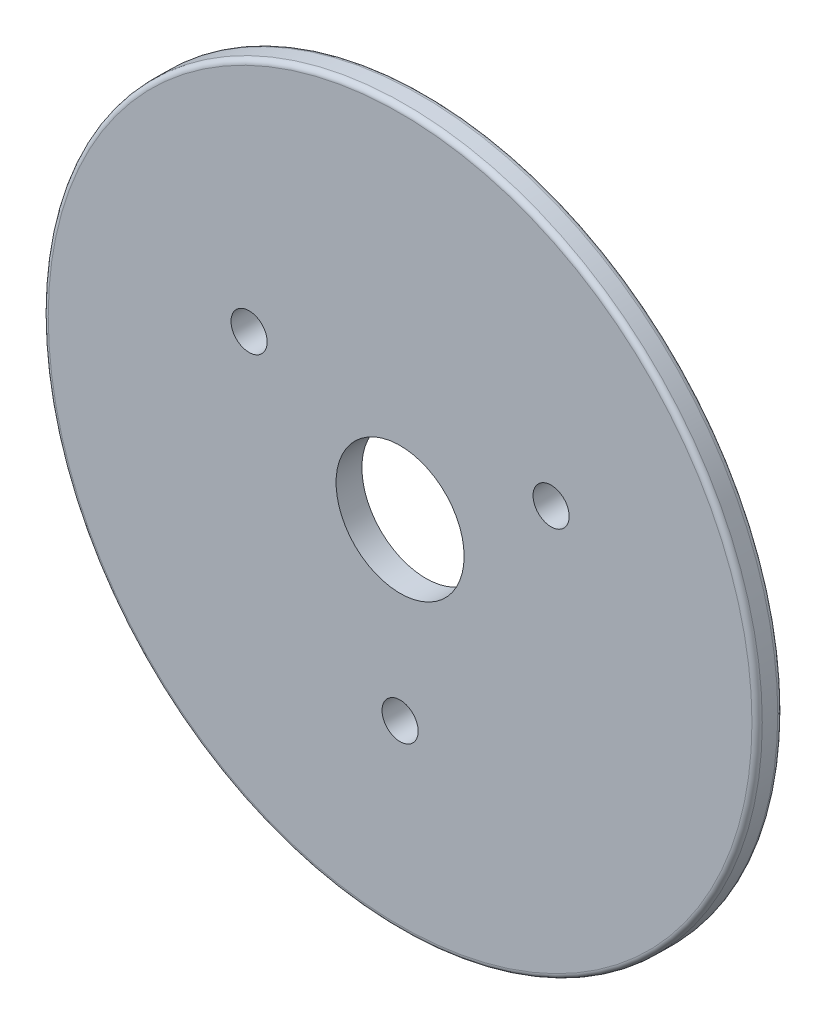
ISO-10303-21;
HEADER;
FILE_DESCRIPTION(('STEP AP214'),'2;1');
FILE_NAME('part.step','',(''),(''),'','','');
FILE_SCHEMA(('AUTOMOTIVE_DESIGN { 1 0 10303 214 1 1 1 1 }'));
ENDSEC;
DATA;
#1=APPLICATION_CONTEXT('core data for automotive mechanical design processes');
#2=APPLICATION_PROTOCOL_DEFINITION('international standard','automotive_design',2000,#1);
#3=PRODUCT_CONTEXT('',#1,'mechanical');
#4=PRODUCT('Part','Part','',(#3));
#5=PRODUCT_RELATED_PRODUCT_CATEGORY('part','',(#4));
#6=PRODUCT_DEFINITION_FORMATION('','',#4);
#7=PRODUCT_DEFINITION_CONTEXT('part definition',#1,'design');
#8=PRODUCT_DEFINITION('design','',#6,#7);
#9=PRODUCT_DEFINITION_SHAPE('','',#8);
#10=(LENGTH_UNIT() NAMED_UNIT(*) SI_UNIT(.MILLI.,.METRE.));
#11=(NAMED_UNIT(*) PLANE_ANGLE_UNIT() SI_UNIT($,.RADIAN.));
#12=(NAMED_UNIT(*) SI_UNIT($,.STERADIAN.) SOLID_ANGLE_UNIT());
#13=UNCERTAINTY_MEASURE_WITH_UNIT(LENGTH_MEASURE(1.E-05),#10,'distance_accuracy_value','');
#14=(GEOMETRIC_REPRESENTATION_CONTEXT(3) GLOBAL_UNCERTAINTY_ASSIGNED_CONTEXT((#13)) GLOBAL_UNIT_ASSIGNED_CONTEXT((#10,
#11,#12)) REPRESENTATION_CONTEXT('',''));
#15=CARTESIAN_POINT('',(0.,0.,0.));
#16=DIRECTION('',(0.,0.,1.));
#17=DIRECTION('',(1.,0.,0.));
#18=AXIS2_PLACEMENT_3D('',#15,#16,#17);
#19=CARTESIAN_POINT('',(14.6246254027445,8.44353141307197,-17.25));
#20=DIRECTION('',(0.,0.,1.));
#21=DIRECTION('',(1.,0.,0.));
#22=AXIS2_PLACEMENT_3D('',#19,#20,#21);
#23=CYLINDRICAL_SURFACE('',#22,1.75);
#24=CARTESIAN_POINT('',(14.6246254027445,8.44353141307197,-17.25));
#25=DIRECTION('',(0.,0.,1.));
#26=DIRECTION('',(1.,0.,0.));
#27=AXIS2_PLACEMENT_3D('',#24,#25,#26);
#28=CIRCLE('',#27,1.75);
#29=CARTESIAN_POINT('',(16.3746254027445,8.44353141307197,-17.25));
#30=VERTEX_POINT('',#29);
#31=EDGE_CURVE('E58',#30,#30,#28,.T.);
#32=ORIENTED_EDGE('',*,*,#31,.F.);
#33=EDGE_LOOP('',(#32));
#34=FACE_BOUND('',#33,.T.);
#35=CARTESIAN_POINT('',(14.6246254027445,8.44353141307197,-14.75));
#36=DIRECTION('',(0.,0.,1.));
#37=DIRECTION('',(1.,0.,0.));
#38=AXIS2_PLACEMENT_3D('',#35,#36,#37);
#39=CIRCLE('',#38,1.75);
#40=CARTESIAN_POINT('',(16.3746254027445,8.44353141307197,-14.75));
#41=VERTEX_POINT('',#40);
#42=EDGE_CURVE('E62',#41,#41,#39,.F.);
#43=ORIENTED_EDGE('',*,*,#42,.F.);
#44=EDGE_LOOP('',(#43));
#45=FACE_BOUND('',#44,.T.);
#46=ADVANCED_FACE('F34',(#34,#45),#23,.F.);
#47=CARTESIAN_POINT('',(-14.6246254027445,8.44353141307194,-17.25));
#48=DIRECTION('',(0.,0.,1.));
#49=DIRECTION('',(1.,0.,0.));
#50=AXIS2_PLACEMENT_3D('',#47,#48,#49);
#51=CYLINDRICAL_SURFACE('',#50,1.75);
#52=CARTESIAN_POINT('',(-14.6246254027445,8.44353141307194,-17.25));
#53=DIRECTION('',(0.,0.,1.));
#54=DIRECTION('',(1.,0.,0.));
#55=AXIS2_PLACEMENT_3D('',#52,#53,#54);
#56=CIRCLE('',#55,1.75);
#57=CARTESIAN_POINT('',(-12.8746254027445,8.44353141307194,-17.25));
#58=VERTEX_POINT('',#57);
#59=EDGE_CURVE('E61',#58,#58,#56,.T.);
#60=ORIENTED_EDGE('',*,*,#59,.F.);
#61=EDGE_LOOP('',(#60));
#62=FACE_BOUND('',#61,.T.);
#63=CARTESIAN_POINT('',(-14.6246254027445,8.44353141307194,-14.75));
#64=DIRECTION('',(0.,0.,1.));
#65=DIRECTION('',(1.,0.,0.));
#66=AXIS2_PLACEMENT_3D('',#63,#64,#65);
#67=CIRCLE('',#66,1.75);
#68=CARTESIAN_POINT('',(-12.8746254027445,8.44353141307194,-14.75));
#69=VERTEX_POINT('',#68);
#70=EDGE_CURVE('E69',#69,#69,#67,.F.);
#71=ORIENTED_EDGE('',*,*,#70,.F.);
#72=EDGE_LOOP('',(#71));
#73=FACE_BOUND('',#72,.T.);
#74=ADVANCED_FACE('F95',(#62,#73),#51,.F.);
#75=CARTESIAN_POINT('',(0.,-16.8870628261439,-17.25));
#76=DIRECTION('',(0.,0.,1.));
#77=DIRECTION('',(1.,0.,0.));
#78=AXIS2_PLACEMENT_3D('',#75,#76,#77);
#79=CYLINDRICAL_SURFACE('',#78,1.75);
#80=CARTESIAN_POINT('',(0.,-16.8870628261439,-17.25));
#81=DIRECTION('',(0.,0.,1.));
#82=DIRECTION('',(1.,0.,0.));
#83=AXIS2_PLACEMENT_3D('',#80,#81,#82);
#84=CIRCLE('',#83,1.75);
#85=CARTESIAN_POINT('',(1.75,-16.8870628261439,-17.25));
#86=VERTEX_POINT('',#85);
#87=EDGE_CURVE('E57',#86,#86,#84,.T.);
#88=ORIENTED_EDGE('',*,*,#87,.F.);
#89=EDGE_LOOP('',(#88));
#90=FACE_BOUND('',#89,.T.);
#91=CARTESIAN_POINT('',(0.,-16.8870628261439,-14.75));
#92=DIRECTION('',(0.,0.,1.));
#93=DIRECTION('',(1.,0.,0.));
#94=AXIS2_PLACEMENT_3D('',#91,#92,#93);
#95=CIRCLE('',#94,1.75);
#96=CARTESIAN_POINT('',(1.75,-16.8870628261439,-14.75));
#97=VERTEX_POINT('',#96);
#98=EDGE_CURVE('E72',#97,#97,#95,.F.);
#99=ORIENTED_EDGE('',*,*,#98,.F.);
#100=EDGE_LOOP('',(#99));
#101=FACE_BOUND('',#100,.T.);
#102=ADVANCED_FACE('F85',(#90,#101),#79,.F.);
#103=CARTESIAN_POINT('',(0.,0.,-7.25));
#104=DIRECTION('',(0.,0.,1.));
#105=DIRECTION('',(1.,0.,0.));
#106=AXIS2_PLACEMENT_3D('',#103,#104,#105);
#107=CYLINDRICAL_SURFACE('',#106,6.2);
#108=CARTESIAN_POINT('',(0.,0.,-17.25));
#109=DIRECTION('',(0.,0.,1.));
#110=DIRECTION('',(1.,0.,0.));
#111=AXIS2_PLACEMENT_3D('',#108,#109,#110);
#112=CIRCLE('',#111,6.2);
#113=CARTESIAN_POINT('',(6.2,0.,-17.25));
#114=VERTEX_POINT('',#113);
#115=EDGE_CURVE('E54',#114,#114,#112,.F.);
#116=CARTESIAN_POINT('',(0.,0.,-14.75));
#117=DIRECTION('',(0.,0.,1.));
#118=DIRECTION('',(1.,0.,0.));
#119=AXIS2_PLACEMENT_3D('',#116,#117,#118);
#120=CIRCLE('',#119,6.2);
#121=CARTESIAN_POINT('',(6.2,0.,-14.75));
#122=VERTEX_POINT('',#121);
#123=EDGE_CURVE('E75',#122,#122,#120,.F.);
#124=CARTESIAN_POINT('',(6.2,0.,-17.25));
#125=CARTESIAN_POINT('',(6.2,0.,-17.2239583333333));
#126=CARTESIAN_POINT('',(6.2,0.,-17.1979166666667));
#127=CARTESIAN_POINT('',(6.2,0.,-17.1458333333333));
#128=CARTESIAN_POINT('',(6.2,0.,-17.1197916666667));
#129=CARTESIAN_POINT('',(6.2,0.,-17.0677083333333));
#130=CARTESIAN_POINT('',(6.2,0.,-17.0416666666667));
#131=CARTESIAN_POINT('',(6.2,0.,-16.9895833333333));
#132=CARTESIAN_POINT('',(6.2,0.,-16.9635416666667));
#133=CARTESIAN_POINT('',(6.2,0.,-16.9114583333333));
#134=CARTESIAN_POINT('',(6.2,0.,-16.8854166666667));
#135=CARTESIAN_POINT('',(6.2,0.,-16.8333333333333));
#136=CARTESIAN_POINT('',(6.2,0.,-16.8072916666667));
#137=CARTESIAN_POINT('',(6.2,0.,-16.7552083333333));
#138=CARTESIAN_POINT('',(6.2,0.,-16.7291666666667));
#139=CARTESIAN_POINT('',(6.2,0.,-16.6770833333333));
#140=CARTESIAN_POINT('',(6.2,0.,-16.6510416666667));
#141=CARTESIAN_POINT('',(6.2,0.,-16.5989583333333));
#142=CARTESIAN_POINT('',(6.2,0.,-16.5729166666667));
#143=CARTESIAN_POINT('',(6.2,0.,-16.5208333333333));
#144=CARTESIAN_POINT('',(6.2,0.,-16.4947916666667));
#145=CARTESIAN_POINT('',(6.2,0.,-16.4427083333333));
#146=CARTESIAN_POINT('',(6.2,0.,-16.4166666666667));
#147=CARTESIAN_POINT('',(6.2,0.,-16.3645833333333));
#148=CARTESIAN_POINT('',(6.2,0.,-16.3385416666667));
#149=CARTESIAN_POINT('',(6.2,0.,-16.2864583333333));
#150=CARTESIAN_POINT('',(6.2,0.,-16.2604166666667));
#151=CARTESIAN_POINT('',(6.2,0.,-16.2083333333333));
#152=CARTESIAN_POINT('',(6.2,0.,-16.1822916666667));
#153=CARTESIAN_POINT('',(6.2,0.,-16.1302083333333));
#154=CARTESIAN_POINT('',(6.2,0.,-16.1041666666667));
#155=CARTESIAN_POINT('',(6.2,0.,-16.0520833333333));
#156=CARTESIAN_POINT('',(6.2,0.,-16.0260416666667));
#157=CARTESIAN_POINT('',(6.2,0.,-15.9739583333333));
#158=CARTESIAN_POINT('',(6.2,0.,-15.9479166666667));
#159=CARTESIAN_POINT('',(6.2,0.,-15.8958333333333));
#160=CARTESIAN_POINT('',(6.2,0.,-15.8697916666667));
#161=CARTESIAN_POINT('',(6.2,0.,-15.8177083333333));
#162=CARTESIAN_POINT('',(6.2,0.,-15.7916666666667));
#163=CARTESIAN_POINT('',(6.2,0.,-15.7395833333333));
#164=CARTESIAN_POINT('',(6.2,0.,-15.7135416666667));
#165=CARTESIAN_POINT('',(6.2,0.,-15.6614583333333));
#166=CARTESIAN_POINT('',(6.2,0.,-15.6354166666667));
#167=CARTESIAN_POINT('',(6.2,0.,-15.5833333333333));
#168=CARTESIAN_POINT('',(6.2,0.,-15.5572916666667));
#169=CARTESIAN_POINT('',(6.2,0.,-15.5052083333333));
#170=CARTESIAN_POINT('',(6.2,0.,-15.4791666666667));
#171=CARTESIAN_POINT('',(6.2,0.,-15.4270833333333));
#172=CARTESIAN_POINT('',(6.2,0.,-15.4010416666667));
#173=CARTESIAN_POINT('',(6.2,0.,-15.3489583333333));
#174=CARTESIAN_POINT('',(6.2,0.,-15.3229166666667));
#175=CARTESIAN_POINT('',(6.2,0.,-15.2708333333333));
#176=CARTESIAN_POINT('',(6.2,0.,-15.2447916666667));
#177=CARTESIAN_POINT('',(6.2,0.,-15.1927083333333));
#178=CARTESIAN_POINT('',(6.2,0.,-15.1666666666667));
#179=CARTESIAN_POINT('',(6.2,0.,-15.1145833333333));
#180=CARTESIAN_POINT('',(6.2,0.,-15.0885416666667));
#181=CARTESIAN_POINT('',(6.2,0.,-15.0364583333333));
#182=CARTESIAN_POINT('',(6.2,0.,-15.0104166666667));
#183=CARTESIAN_POINT('',(6.2,0.,-14.9583333333333));
#184=CARTESIAN_POINT('',(6.2,0.,-14.9322916666667));
#185=CARTESIAN_POINT('',(6.2,0.,-14.8802083333333));
#186=CARTESIAN_POINT('',(6.2,0.,-14.8541666666667));
#187=CARTESIAN_POINT('',(6.2,0.,-14.8020833333333));
#188=CARTESIAN_POINT('',(6.2,0.,-14.7760416666667));
#189=CARTESIAN_POINT('',(6.2,0.,-14.75));
#190=B_SPLINE_CURVE_WITH_KNOTS('',3,(#124,#125,#126,#127,#128,#129,#130,#131,#132,#133,#134,
#135,#136,#137,#138,#139,#140,#141,#142,#143,#144,#145,#146,#147,#148,#149,#150,#151,#152,#153,
#154,#155,#156,#157,#158,#159,#160,#161,#162,#163,#164,#165,#166,#167,#168,#169,#170,#171,#172,
#173,#174,#175,#176,#177,#178,#179,#180,#181,#182,#183,#184,#185,#186,#187,#188,#189),
.UNSPECIFIED.,.F.,.F.,(4,2,2,2,2,2,2,2,2,2,2,2,2,2,2,2,2,2,2,2,2,2,2,2,2,2,2,2,2,2,2,2,4),(0.,
0.0781250000000018,0.15625,0.234375000000002,0.3125,0.390625000000002,0.46875,0.546875000000002,
0.625000000000001,0.703125000000002,0.781250000000001,0.859375000000002,0.937500000000001,
1.015625,1.09375,1.171875,1.25,1.328125,1.40625,1.484375,1.5625,1.640625,1.71875,1.796875,1.875,
1.953125,2.03125,2.109375,2.1875,2.265625,2.34375,2.421875,2.5),.UNSPECIFIED.);
#191=EDGE_CURVE('BSEAM82',#114,#122,#190,.T.);
#192=ORIENTED_EDGE('',*,*,#115,.T.);
#193=ORIENTED_EDGE('',*,*,#123,.F.);
#194=ORIENTED_EDGE('',*,*,#191,.T.);
#195=ORIENTED_EDGE('',*,*,#191,.F.);
#196=EDGE_LOOP('',(#192,#194,#193,#195));
#197=FACE_BOUND('',#196,.T.);
#198=ADVANCED_FACE('F82',(#197),#107,.F.);
#199=CARTESIAN_POINT('',(0.,0.,-17.25));
#200=DIRECTION('',(0.,0.,1.));
#201=DIRECTION('',(1.,0.,0.));
#202=AXIS2_PLACEMENT_3D('',#199,#200,#201);
#203=CYLINDRICAL_SURFACE('',#202,34.5756536779815);
#204=CARTESIAN_POINT('',(0.,0.,-15.25));
#205=DIRECTION('',(0.,0.,-1.));
#206=DIRECTION('',(-1.,0.,0.));
#207=AXIS2_PLACEMENT_3D('',#204,#205,#206);
#208=CIRCLE('',#207,34.5756536779815);
#209=CARTESIAN_POINT('',(-34.5756536779815,0.,-15.25));
#210=VERTEX_POINT('',#209);
#211=EDGE_CURVE('E45',#210,#210,#208,.T.);
#212=ORIENTED_EDGE('',*,*,#211,.T.);
#213=EDGE_LOOP('',(#212));
#214=FACE_BOUND('',#213,.T.);
#215=CARTESIAN_POINT('',(0.,0.,-16.75));
#216=DIRECTION('',(0.,0.,-1.));
#217=DIRECTION('',(-1.,0.,0.));
#218=AXIS2_PLACEMENT_3D('',#215,#216,#217);
#219=CIRCLE('',#218,34.5756536779815);
#220=CARTESIAN_POINT('',(-34.5756536779815,0.,-16.75));
#221=VERTEX_POINT('',#220);
#222=EDGE_CURVE('E49',#221,#221,#219,.F.);
#223=ORIENTED_EDGE('',*,*,#222,.T.);
#224=EDGE_LOOP('',(#223));
#225=FACE_BOUND('',#224,.T.);
#226=ADVANCED_FACE('F84',(#214,#225),#203,.T.);
#227=CARTESIAN_POINT('',(0.,0.,-17.25));
#228=DIRECTION('',(0.,0.,-1.));
#229=DIRECTION('',(-1.,0.,0.));
#230=AXIS2_PLACEMENT_3D('',#227,#228,#229);
#231=PLANE('',#230);
#232=ORIENTED_EDGE('',*,*,#87,.T.);
#233=EDGE_LOOP('',(#232));
#234=FACE_BOUND('',#233,.T.);
#235=ORIENTED_EDGE('',*,*,#59,.T.);
#236=EDGE_LOOP('',(#235));
#237=FACE_BOUND('',#236,.T.);
#238=ORIENTED_EDGE('',*,*,#31,.T.);
#239=EDGE_LOOP('',(#238));
#240=FACE_BOUND('',#239,.T.);
#241=ORIENTED_EDGE('',*,*,#115,.F.);
#242=EDGE_LOOP('',(#241));
#243=FACE_BOUND('',#242,.T.);
#244=CARTESIAN_POINT('',(0.,0.,-17.25));
#245=DIRECTION('',(0.,0.,-1.));
#246=DIRECTION('',(-1.,0.,0.));
#247=AXIS2_PLACEMENT_3D('',#244,#245,#246);
#248=CIRCLE('',#247,34.0756536779814);
#249=CARTESIAN_POINT('',(-34.0756536779814,0.,-17.25));
#250=VERTEX_POINT('',#249);
#251=EDGE_CURVE('E11',#250,#250,#248,.T.);
#252=ORIENTED_EDGE('',*,*,#251,.T.);
#253=EDGE_LOOP('',(#252));
#254=FACE_BOUND('',#253,.T.);
#255=ADVANCED_FACE('F92',(#234,#237,#240,#243,#254),#231,.T.);
#256=CARTESIAN_POINT('',(0.,0.,-14.75));
#257=DIRECTION('',(0.,0.,-1.));
#258=DIRECTION('',(-1.,0.,0.));
#259=AXIS2_PLACEMENT_3D('',#256,#257,#258);
#260=PLANE('',#259);
#261=CARTESIAN_POINT('',(0.,0.,-14.75));
#262=DIRECTION('',(0.,0.,-1.));
#263=DIRECTION('',(-1.,0.,0.));
#264=AXIS2_PLACEMENT_3D('',#261,#262,#263);
#265=CIRCLE('',#264,34.0756536779814);
#266=CARTESIAN_POINT('',(-34.0756536779814,0.,-14.75));
#267=VERTEX_POINT('',#266);
#268=EDGE_CURVE('E41',#267,#267,#265,.F.);
#269=ORIENTED_EDGE('',*,*,#268,.T.);
#270=EDGE_LOOP('',(#269));
#271=FACE_BOUND('',#270,.T.);
#272=ORIENTED_EDGE('',*,*,#123,.T.);
#273=EDGE_LOOP('',(#272));
#274=FACE_BOUND('',#273,.T.);
#275=ORIENTED_EDGE('',*,*,#98,.T.);
#276=EDGE_LOOP('',(#275));
#277=FACE_BOUND('',#276,.T.);
#278=ORIENTED_EDGE('',*,*,#70,.T.);
#279=EDGE_LOOP('',(#278));
#280=FACE_BOUND('',#279,.T.);
#281=ORIENTED_EDGE('',*,*,#42,.T.);
#282=EDGE_LOOP('',(#281));
#283=FACE_BOUND('',#282,.T.);
#284=ADVANCED_FACE('F79',(#271,#274,#277,#280,#283),#260,.F.);
#285=CARTESIAN_POINT('',(0.,0.,-15.25));
#286=DIRECTION('',(0.,0.,-1.));
#287=DIRECTION('',(-1.,0.,0.));
#288=AXIS2_PLACEMENT_3D('',#285,#286,#287);
#289=TOROIDAL_SURFACE('',#288,34.0756536779814,0.5);
#290=ORIENTED_EDGE('',*,*,#268,.F.);
#291=EDGE_LOOP('',(#290));
#292=FACE_BOUND('',#291,.T.);
#293=ORIENTED_EDGE('',*,*,#211,.F.);
#294=EDGE_LOOP('',(#293));
#295=FACE_BOUND('',#294,.T.);
#296=ADVANCED_FACE('F113',(#292,#295),#289,.T.);
#297=CARTESIAN_POINT('',(0.,0.,-16.75));
#298=DIRECTION('',(0.,0.,-1.));
#299=DIRECTION('',(-1.,0.,0.));
#300=AXIS2_PLACEMENT_3D('',#297,#298,#299);
#301=TOROIDAL_SURFACE('',#300,34.0756536779814,0.5);
#302=ORIENTED_EDGE('',*,*,#222,.F.);
#303=EDGE_LOOP('',(#302));
#304=FACE_BOUND('',#303,.T.);
#305=ORIENTED_EDGE('',*,*,#251,.F.);
#306=EDGE_LOOP('',(#305));
#307=FACE_BOUND('',#306,.T.);
#308=ADVANCED_FACE('F36',(#304,#307),#301,.T.);
#309=CLOSED_SHELL('',(#46,#74,#102,#198,#226,#255,#284,#296,#308));
#310=MANIFOLD_SOLID_BREP('B2',#309);
#311=ADVANCED_BREP_SHAPE_REPRESENTATION('',(#18,#310),#14);
#312=SHAPE_DEFINITION_REPRESENTATION(#9,#311);
ENDSEC;
END-ISO-10303-21;
